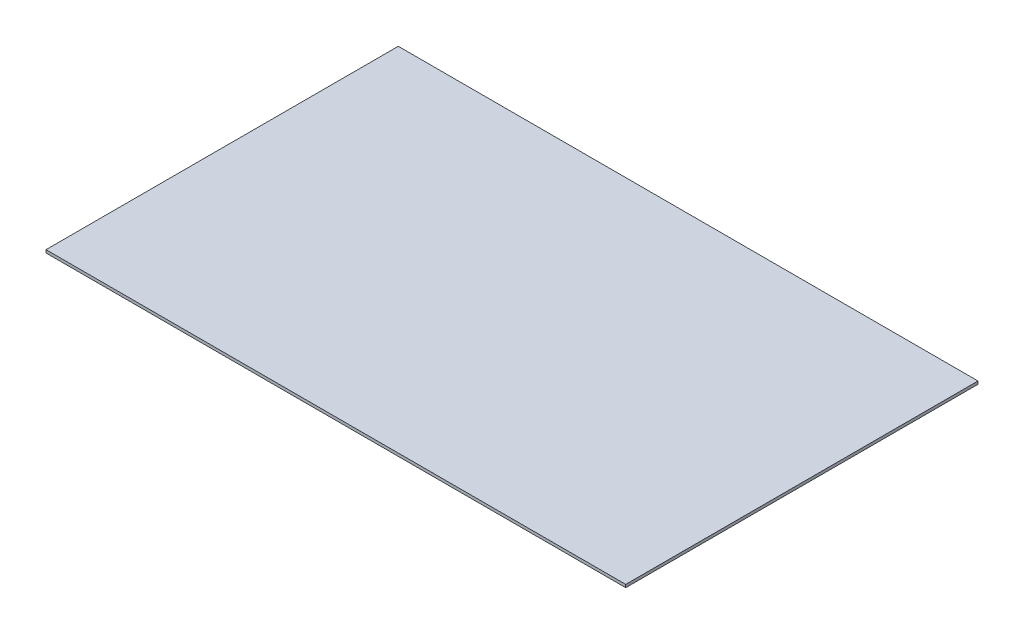
ISO-10303-21;
HEADER;
FILE_DESCRIPTION(('STEP AP214'),'2;1');
FILE_NAME('part.step','',(''),(''),'','','');
FILE_SCHEMA(('AUTOMOTIVE_DESIGN { 1 0 10303 214 1 1 1 1 }'));
ENDSEC;
DATA;
#1=APPLICATION_CONTEXT('core data for automotive mechanical design processes');
#2=APPLICATION_PROTOCOL_DEFINITION('international standard','automotive_design',2000,#1);
#3=PRODUCT_CONTEXT('',#1,'mechanical');
#4=PRODUCT('Part','Part','',(#3));
#5=PRODUCT_RELATED_PRODUCT_CATEGORY('part','',(#4));
#6=PRODUCT_DEFINITION_FORMATION('','',#4);
#7=PRODUCT_DEFINITION_CONTEXT('part definition',#1,'design');
#8=PRODUCT_DEFINITION('design','',#6,#7);
#9=PRODUCT_DEFINITION_SHAPE('','',#8);
#10=(LENGTH_UNIT() NAMED_UNIT(*) SI_UNIT(.MILLI.,.METRE.));
#11=(NAMED_UNIT(*) PLANE_ANGLE_UNIT() SI_UNIT($,.RADIAN.));
#12=(NAMED_UNIT(*) SI_UNIT($,.STERADIAN.) SOLID_ANGLE_UNIT());
#13=UNCERTAINTY_MEASURE_WITH_UNIT(LENGTH_MEASURE(1.E-05),#10,'distance_accuracy_value','');
#14=(GEOMETRIC_REPRESENTATION_CONTEXT(3) GLOBAL_UNCERTAINTY_ASSIGNED_CONTEXT((#13)) GLOBAL_UNIT_ASSIGNED_CONTEXT((#10,
#11,#12)) REPRESENTATION_CONTEXT('',''));
#15=CARTESIAN_POINT('',(0.,0.,0.));
#16=DIRECTION('',(0.,0.,1.));
#17=DIRECTION('',(1.,0.,0.));
#18=AXIS2_PLACEMENT_3D('',#15,#16,#17);
#19=CARTESIAN_POINT('',(150.,1.5,91.15));
#20=DIRECTION('',(-1.,0.,0.));
#21=DIRECTION('',(0.,0.,1.));
#22=AXIS2_PLACEMENT_3D('',#19,#20,#21);
#23=PLANE('',#22);
#24=DIRECTION('',(0.,0.,-1.));
#25=VECTOR('',#24,1.);
#26=CARTESIAN_POINT('',(150.,0.,91.15));
#27=LINE('',#26,#25);
#28=CARTESIAN_POINT('',(150.,0.,91.15));
#29=VERTEX_POINT('',#28);
#30=CARTESIAN_POINT('',(150.,0.,-91.15));
#31=VERTEX_POINT('',#30);
#32=EDGE_CURVE('E104',#29,#31,#27,.T.);
#33=ORIENTED_EDGE('',*,*,#32,.T.);
#34=DIRECTION('',(0.,-1.,0.));
#35=VECTOR('',#34,1.);
#36=CARTESIAN_POINT('',(150.,1.5,-91.15));
#37=LINE('',#36,#35);
#38=CARTESIAN_POINT('',(150.,1.5,-91.15));
#39=VERTEX_POINT('',#38);
#40=EDGE_CURVE('E11',#39,#31,#37,.T.);
#41=ORIENTED_EDGE('',*,*,#40,.F.);
#42=DIRECTION('',(0.,0.,-1.));
#43=VECTOR('',#42,1.);
#44=CARTESIAN_POINT('',(150.,1.5,91.15));
#45=LINE('',#44,#43);
#46=CARTESIAN_POINT('',(150.,1.5,91.15));
#47=VERTEX_POINT('',#46);
#48=EDGE_CURVE('E92',#47,#39,#45,.T.);
#49=ORIENTED_EDGE('',*,*,#48,.F.);
#50=DIRECTION('',(0.,-1.,0.));
#51=VECTOR('',#50,1.);
#52=CARTESIAN_POINT('',(150.,1.5,91.15));
#53=LINE('',#52,#51);
#54=EDGE_CURVE('E100',#47,#29,#53,.T.);
#55=ORIENTED_EDGE('',*,*,#54,.T.);
#56=EDGE_LOOP('',(#33,#41,#49,#55));
#57=FACE_BOUND('',#56,.T.);
#58=ADVANCED_FACE('F41',(#57),#23,.F.);
#59=CARTESIAN_POINT('',(-150.,1.5,-91.15));
#60=DIRECTION('',(0.,0.,1.));
#61=DIRECTION('',(1.,0.,0.));
#62=AXIS2_PLACEMENT_3D('',#59,#60,#61);
#63=PLANE('',#62);
#64=DIRECTION('',(-1.,0.,0.));
#65=VECTOR('',#64,1.);
#66=CARTESIAN_POINT('',(-150.,0.,-91.15));
#67=LINE('',#66,#65);
#68=CARTESIAN_POINT('',(-150.,0.,-91.15));
#69=VERTEX_POINT('',#68);
#70=EDGE_CURVE('E96',#31,#69,#67,.T.);
#71=ORIENTED_EDGE('',*,*,#70,.T.);
#72=DIRECTION('',(0.,-1.,0.));
#73=VECTOR('',#72,1.);
#74=CARTESIAN_POINT('',(-150.,1.5,-91.15));
#75=LINE('',#74,#73);
#76=CARTESIAN_POINT('',(-150.,1.5,-91.15));
#77=VERTEX_POINT('',#76);
#78=EDGE_CURVE('E49',#77,#69,#75,.T.);
#79=ORIENTED_EDGE('',*,*,#78,.F.);
#80=DIRECTION('',(-1.,0.,0.));
#81=VECTOR('',#80,1.);
#82=CARTESIAN_POINT('',(-150.,1.5,-91.15));
#83=LINE('',#82,#81);
#84=EDGE_CURVE('E87',#39,#77,#83,.T.);
#85=ORIENTED_EDGE('',*,*,#84,.F.);
#86=ORIENTED_EDGE('',*,*,#40,.T.);
#87=EDGE_LOOP('',(#71,#79,#85,#86));
#88=FACE_BOUND('',#87,.T.);
#89=ADVANCED_FACE('F95',(#88),#63,.F.);
#90=CARTESIAN_POINT('',(-150.,1.5,91.15));
#91=DIRECTION('',(1.,0.,0.));
#92=DIRECTION('',(0.,0.,-1.));
#93=AXIS2_PLACEMENT_3D('',#90,#91,#92);
#94=PLANE('',#93);
#95=DIRECTION('',(0.,0.,1.));
#96=VECTOR('',#95,1.);
#97=CARTESIAN_POINT('',(-150.,0.,91.15));
#98=LINE('',#97,#96);
#99=CARTESIAN_POINT('',(-150.,0.,91.15));
#100=VERTEX_POINT('',#99);
#101=EDGE_CURVE('E74',#69,#100,#98,.T.);
#102=ORIENTED_EDGE('',*,*,#101,.T.);
#103=DIRECTION('',(0.,-1.,0.));
#104=VECTOR('',#103,1.);
#105=CARTESIAN_POINT('',(-150.,1.5,91.15));
#106=LINE('',#105,#104);
#107=CARTESIAN_POINT('',(-150.,1.5,91.15));
#108=VERTEX_POINT('',#107);
#109=EDGE_CURVE('E97',#108,#100,#106,.T.);
#110=ORIENTED_EDGE('',*,*,#109,.F.);
#111=DIRECTION('',(0.,0.,1.));
#112=VECTOR('',#111,1.);
#113=CARTESIAN_POINT('',(-150.,1.5,91.15));
#114=LINE('',#113,#112);
#115=EDGE_CURVE('E90',#77,#108,#114,.T.);
#116=ORIENTED_EDGE('',*,*,#115,.F.);
#117=ORIENTED_EDGE('',*,*,#78,.T.);
#118=EDGE_LOOP('',(#102,#110,#116,#117));
#119=FACE_BOUND('',#118,.T.);
#120=ADVANCED_FACE('F98',(#119),#94,.F.);
#121=CARTESIAN_POINT('',(-150.,1.5,91.15));
#122=DIRECTION('',(0.,0.,-1.));
#123=DIRECTION('',(-1.,0.,0.));
#124=AXIS2_PLACEMENT_3D('',#121,#122,#123);
#125=PLANE('',#124);
#126=DIRECTION('',(1.,0.,0.));
#127=VECTOR('',#126,1.);
#128=CARTESIAN_POINT('',(-150.,0.,91.15));
#129=LINE('',#128,#127);
#130=EDGE_CURVE('E80',#100,#29,#129,.T.);
#131=ORIENTED_EDGE('',*,*,#130,.T.);
#132=ORIENTED_EDGE('',*,*,#54,.F.);
#133=DIRECTION('',(1.,0.,0.));
#134=VECTOR('',#133,1.);
#135=CARTESIAN_POINT('',(-150.,1.5,91.15));
#136=LINE('',#135,#134);
#137=EDGE_CURVE('E57',#108,#47,#136,.T.);
#138=ORIENTED_EDGE('',*,*,#137,.F.);
#139=ORIENTED_EDGE('',*,*,#109,.T.);
#140=EDGE_LOOP('',(#131,#132,#138,#139));
#141=FACE_BOUND('',#140,.T.);
#142=ADVANCED_FACE('F111',(#141),#125,.F.);
#143=CARTESIAN_POINT('',(0.,1.5,0.));
#144=DIRECTION('',(0.,-1.,0.));
#145=DIRECTION('',(0.,0.,-1.));
#146=AXIS2_PLACEMENT_3D('',#143,#144,#145);
#147=PLANE('',#146);
#148=ORIENTED_EDGE('',*,*,#48,.T.);
#149=ORIENTED_EDGE('',*,*,#84,.T.);
#150=ORIENTED_EDGE('',*,*,#115,.T.);
#151=ORIENTED_EDGE('',*,*,#137,.T.);
#152=EDGE_LOOP('',(#148,#149,#150,#151));
#153=FACE_BOUND('',#152,.T.);
#154=ADVANCED_FACE('F88',(#153),#147,.F.);
#155=CARTESIAN_POINT('',(0.,0.,0.));
#156=DIRECTION('',(0.,-1.,0.));
#157=DIRECTION('',(0.,0.,-1.));
#158=AXIS2_PLACEMENT_3D('',#155,#156,#157);
#159=PLANE('',#158);
#160=ORIENTED_EDGE('',*,*,#32,.F.);
#161=ORIENTED_EDGE('',*,*,#130,.F.);
#162=ORIENTED_EDGE('',*,*,#101,.F.);
#163=ORIENTED_EDGE('',*,*,#70,.F.);
#164=EDGE_LOOP('',(#160,#161,#162,#163));
#165=FACE_BOUND('',#164,.T.);
#166=ADVANCED_FACE('F114',(#165),#159,.T.);
#167=CLOSED_SHELL('',(#58,#89,#120,#142,#154,#166));
#168=MANIFOLD_SOLID_BREP('B2',#167);
#169=ADVANCED_BREP_SHAPE_REPRESENTATION('',(#18,#168),#14);
#170=SHAPE_DEFINITION_REPRESENTATION(#9,#169);
ENDSEC;
END-ISO-10303-21;
